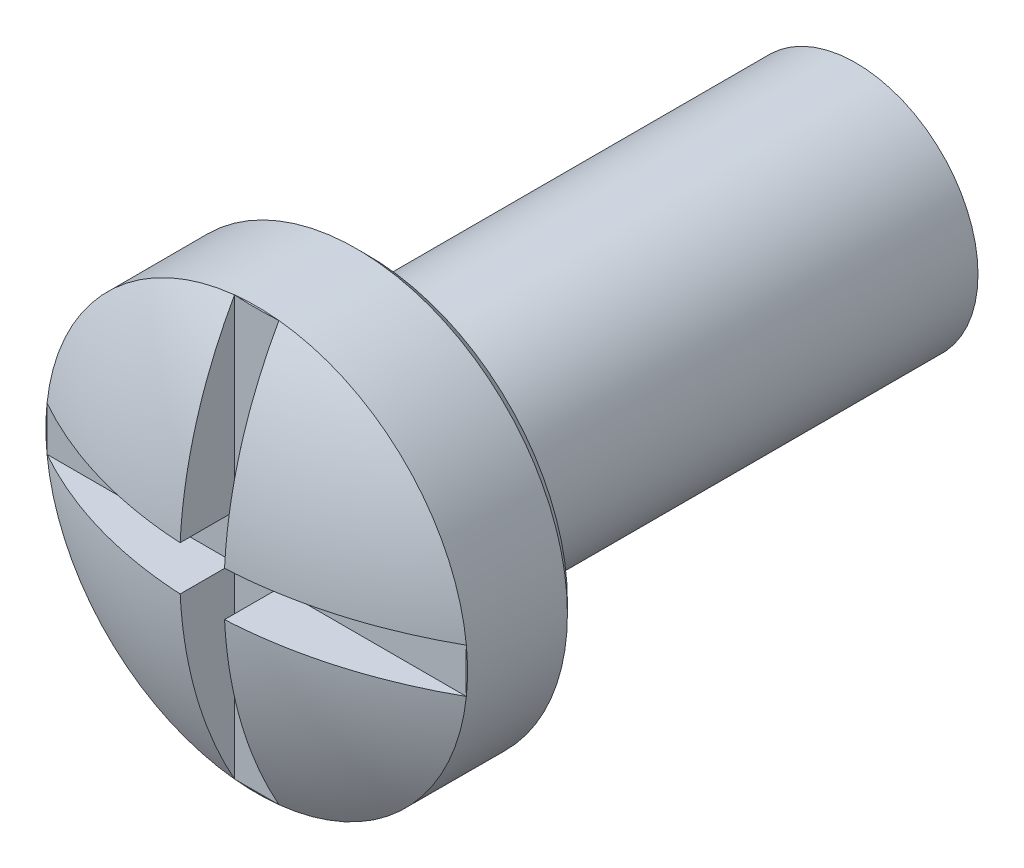
ISO-10303-21;
HEADER;
FILE_DESCRIPTION(('STEP AP214'),'2;1');
FILE_NAME('part.step','',(''),(''),'','','');
FILE_SCHEMA(('AUTOMOTIVE_DESIGN { 1 0 10303 214 1 1 1 1 }'));
ENDSEC;
DATA;
#1=APPLICATION_CONTEXT('core data for automotive mechanical design processes');
#2=APPLICATION_PROTOCOL_DEFINITION('international standard','automotive_design',2000,#1);
#3=PRODUCT_CONTEXT('',#1,'mechanical');
#4=PRODUCT('Part','Part','',(#3));
#5=PRODUCT_RELATED_PRODUCT_CATEGORY('part','',(#4));
#6=PRODUCT_DEFINITION_FORMATION('','',#4);
#7=PRODUCT_DEFINITION_CONTEXT('part definition',#1,'design');
#8=PRODUCT_DEFINITION('design','',#6,#7);
#9=PRODUCT_DEFINITION_SHAPE('','',#8);
#10=(LENGTH_UNIT() NAMED_UNIT(*) SI_UNIT(.MILLI.,.METRE.));
#11=(NAMED_UNIT(*) PLANE_ANGLE_UNIT() SI_UNIT($,.RADIAN.));
#12=(NAMED_UNIT(*) SI_UNIT($,.STERADIAN.) SOLID_ANGLE_UNIT());
#13=UNCERTAINTY_MEASURE_WITH_UNIT(LENGTH_MEASURE(1.E-05),#10,'distance_accuracy_value','');
#14=(GEOMETRIC_REPRESENTATION_CONTEXT(3) GLOBAL_UNCERTAINTY_ASSIGNED_CONTEXT((#13)) GLOBAL_UNIT_ASSIGNED_CONTEXT((#10,
#11,#12)) REPRESENTATION_CONTEXT('',''));
#15=CARTESIAN_POINT('',(0.,0.,0.));
#16=DIRECTION('',(0.,0.,1.));
#17=DIRECTION('',(1.,0.,0.));
#18=AXIS2_PLACEMENT_3D('',#15,#16,#17);
#19=CARTESIAN_POINT('',(0.,0.,-11.8));
#20=DIRECTION('',(0.,0.,-1.));
#21=DIRECTION('',(0.,1.,0.));
#22=AXIS2_PLACEMENT_3D('',#19,#20,#21);
#23=SPHERICAL_SURFACE('',#22,19.3);
#24=CARTESIAN_POINT('',(-1.,0.,-11.8));
#25=DIRECTION('',(-1.,0.,0.));
#26=DIRECTION('',(0.,0.,1.));
#27=AXIS2_PLACEMENT_3D('',#24,#25,#26);
#28=CIRCLE('',#27,19.2740758533321);
#29=CARTESIAN_POINT('',(-1.,-9.44722181384559,5.));
#30=VERTEX_POINT('',#29);
#31=CARTESIAN_POINT('',(-1.,-1.,7.44811679100061));
#32=VERTEX_POINT('',#31);
#33=EDGE_CURVE('E320',#30,#32,#28,.T.);
#34=ORIENTED_EDGE('',*,*,#33,.T.);
#35=CARTESIAN_POINT('',(0.,-1.,-11.8));
#36=DIRECTION('',(0.,1.,0.));
#37=DIRECTION('',(0.,0.,1.));
#38=AXIS2_PLACEMENT_3D('',#35,#36,#37);
#39=CIRCLE('',#38,19.2740758533321);
#40=CARTESIAN_POINT('',(-9.4472218138456,-0.999999999999952,5.));
#41=VERTEX_POINT('',#40);
#42=EDGE_CURVE('E208',#41,#32,#39,.T.);
#43=ORIENTED_EDGE('',*,*,#42,.F.);
#44=CARTESIAN_POINT('',(0.,0.,5.));
#45=DIRECTION('',(0.,0.,1.));
#46=DIRECTION('',(1.,0.,0.));
#47=AXIS2_PLACEMENT_3D('',#44,#45,#46);
#48=CIRCLE('',#47,9.5);
#49=EDGE_CURVE('E347',#41,#30,#48,.T.);
#50=ORIENTED_EDGE('',*,*,#49,.T.);
#51=EDGE_LOOP('',(#34,#43,#50));
#52=FACE_BOUND('',#51,.T.);
#53=ADVANCED_FACE('F90',(#52),#23,.T.);
#54=CARTESIAN_POINT('',(-9.44722181384559,1.,5.));
#55=VERTEX_POINT('',#54);
#56=EDGE_CURVE('E354',#55,#41,#48,.T.);
#57=ORIENTED_EDGE('',*,*,#56,.T.);
#58=CARTESIAN_POINT('',(-9.44722181384559,0.,-11.8));
#59=DIRECTION('',(1.,0.,0.));
#60=DIRECTION('',(0.,0.,-1.));
#61=AXIS2_PLACEMENT_3D('',#58,#59,#60);
#62=CIRCLE('',#61,16.8297355891291);
#63=EDGE_CURVE('E212',#55,#41,#62,.T.);
#64=ORIENTED_EDGE('',*,*,#63,.F.);
#65=EDGE_LOOP('',(#57,#64));
#66=FACE_BOUND('',#65,.T.);
#67=ADVANCED_FACE('F278',(#66),#23,.T.);
#68=CARTESIAN_POINT('',(0.,1.,-11.8));
#69=DIRECTION('',(0.,1.,0.));
#70=DIRECTION('',(0.,0.,1.));
#71=AXIS2_PLACEMENT_3D('',#68,#69,#70);
#72=CIRCLE('',#71,19.2740758533321);
#73=CARTESIAN_POINT('',(-1.,1.,7.44811679100061));
#74=VERTEX_POINT('',#73);
#75=EDGE_CURVE('E181',#55,#74,#72,.T.);
#76=ORIENTED_EDGE('',*,*,#75,.T.);
#77=CARTESIAN_POINT('',(-1.,9.44722181384559,5.));
#78=VERTEX_POINT('',#77);
#79=EDGE_CURVE('E171',#74,#78,#28,.T.);
#80=ORIENTED_EDGE('',*,*,#79,.T.);
#81=EDGE_CURVE('E327',#78,#55,#48,.T.);
#82=ORIENTED_EDGE('',*,*,#81,.T.);
#83=EDGE_LOOP('',(#76,#80,#82));
#84=FACE_BOUND('',#83,.T.);
#85=ADVANCED_FACE('F286',(#84),#23,.T.);
#86=CARTESIAN_POINT('',(9.44722181384559,1.,5.));
#87=VERTEX_POINT('',#86);
#88=CARTESIAN_POINT('',(0.999999999999972,9.4472218138456,5.));
#89=VERTEX_POINT('',#88);
#90=EDGE_CURVE('E243',#87,#89,#48,.T.);
#91=ORIENTED_EDGE('',*,*,#90,.T.);
#92=CARTESIAN_POINT('',(1.,0.,-11.8));
#93=DIRECTION('',(-1.,0.,0.));
#94=DIRECTION('',(0.,0.,1.));
#95=AXIS2_PLACEMENT_3D('',#92,#93,#94);
#96=CIRCLE('',#95,19.2740758533321);
#97=CARTESIAN_POINT('',(1.,1.,7.44811679100061));
#98=VERTEX_POINT('',#97);
#99=EDGE_CURVE('E319',#98,#89,#96,.T.);
#100=ORIENTED_EDGE('',*,*,#99,.F.);
#101=EDGE_CURVE('E203',#98,#87,#72,.T.);
#102=ORIENTED_EDGE('',*,*,#101,.T.);
#103=EDGE_LOOP('',(#91,#100,#102));
#104=FACE_BOUND('',#103,.T.);
#105=ADVANCED_FACE('F332',(#104),#23,.T.);
#106=CARTESIAN_POINT('',(1.,-9.44722181384559,5.));
#107=VERTEX_POINT('',#106);
#108=EDGE_CURVE('E342',#30,#107,#48,.T.);
#109=ORIENTED_EDGE('',*,*,#108,.T.);
#110=CARTESIAN_POINT('',(0.,-9.44722181384559,-11.8));
#111=DIRECTION('',(0.,1.,0.));
#112=DIRECTION('',(0.,0.,1.));
#113=AXIS2_PLACEMENT_3D('',#110,#111,#112);
#114=CIRCLE('',#113,16.8297355891291);
#115=EDGE_CURVE('E374',#30,#107,#114,.T.);
#116=ORIENTED_EDGE('',*,*,#115,.F.);
#117=EDGE_LOOP('',(#109,#116));
#118=FACE_BOUND('',#117,.T.);
#119=ADVANCED_FACE('F311',(#118),#23,.T.);
#120=CARTESIAN_POINT('',(1.,-1.,7.44811679100061));
#121=VERTEX_POINT('',#120);
#122=CARTESIAN_POINT('',(9.44722181384559,-1.,5.));
#123=VERTEX_POINT('',#122);
#124=EDGE_CURVE('E207',#121,#123,#39,.T.);
#125=ORIENTED_EDGE('',*,*,#124,.F.);
#126=EDGE_CURVE('E107',#107,#121,#96,.T.);
#127=ORIENTED_EDGE('',*,*,#126,.F.);
#128=EDGE_CURVE('E339',#107,#123,#48,.T.);
#129=ORIENTED_EDGE('',*,*,#128,.T.);
#130=EDGE_LOOP('',(#125,#127,#129));
#131=FACE_BOUND('',#130,.T.);
#132=ADVANCED_FACE('F304',(#131),#23,.T.);
#133=CARTESIAN_POINT('',(0.,9.44722181384559,-11.8));
#134=DIRECTION('',(0.,1.,0.));
#135=DIRECTION('',(0.,0.,1.));
#136=AXIS2_PLACEMENT_3D('',#133,#134,#135);
#137=CIRCLE('',#136,16.8297355891291);
#138=EDGE_CURVE('E315',#78,#89,#137,.T.);
#139=ORIENTED_EDGE('',*,*,#138,.T.);
#140=EDGE_CURVE('E246',#89,#78,#48,.T.);
#141=ORIENTED_EDGE('',*,*,#140,.T.);
#142=EDGE_LOOP('',(#139,#141));
#143=FACE_BOUND('',#142,.T.);
#144=ADVANCED_FACE('F294',(#143),#23,.T.);
#145=CARTESIAN_POINT('',(0.,0.,5.));
#146=DIRECTION('',(0.,0.,-1.));
#147=DIRECTION('',(-1.,0.,0.));
#148=AXIS2_PLACEMENT_3D('',#145,#146,#147);
#149=CYLINDRICAL_SURFACE('',#148,9.5);
#150=CARTESIAN_POINT('',(0.,0.,0.500000000000011));
#151=DIRECTION('',(0.,0.,1.));
#152=DIRECTION('',(1.,0.,0.));
#153=AXIS2_PLACEMENT_3D('',#150,#151,#152);
#154=CIRCLE('',#153,9.5);
#155=CARTESIAN_POINT('',(9.5,0.,0.500000000000011));
#156=VERTEX_POINT('',#155);
#157=EDGE_CURVE('E100',#156,#156,#154,.T.);
#158=ORIENTED_EDGE('',*,*,#157,.T.);
#159=EDGE_LOOP('',(#158));
#160=FACE_BOUND('',#159,.T.);
#161=ORIENTED_EDGE('',*,*,#90,.F.);
#162=EDGE_CURVE('E239',#123,#87,#48,.T.);
#163=ORIENTED_EDGE('',*,*,#162,.F.);
#164=ORIENTED_EDGE('',*,*,#128,.F.);
#165=ORIENTED_EDGE('',*,*,#108,.F.);
#166=ORIENTED_EDGE('',*,*,#49,.F.);
#167=ORIENTED_EDGE('',*,*,#56,.F.);
#168=ORIENTED_EDGE('',*,*,#81,.F.);
#169=ORIENTED_EDGE('',*,*,#140,.F.);
#170=EDGE_LOOP('',(#161,#163,#164,#165,#166,#167,#168,#169));
#171=FACE_BOUND('',#170,.T.);
#172=ADVANCED_FACE('F252',(#160,#171),#149,.T.);
#173=CARTESIAN_POINT('',(0.,0.,0.));
#174=DIRECTION('',(0.,0.,1.));
#175=DIRECTION('',(1.,0.,0.));
#176=AXIS2_PLACEMENT_3D('',#173,#174,#175);
#177=PLANE('',#176);
#178=CARTESIAN_POINT('',(0.,0.,0.));
#179=DIRECTION('',(0.,0.,1.));
#180=DIRECTION('',(1.,0.,0.));
#181=AXIS2_PLACEMENT_3D('',#178,#179,#180);
#182=CIRCLE('',#181,8.99999999999999);
#183=CARTESIAN_POINT('',(8.99999999999999,0.,0.));
#184=VERTEX_POINT('',#183);
#185=EDGE_CURVE('E12',#184,#184,#182,.F.);
#186=ORIENTED_EDGE('',*,*,#185,.T.);
#187=EDGE_LOOP('',(#186));
#188=FACE_BOUND('',#187,.T.);
#189=CARTESIAN_POINT('',(0.,0.,0.));
#190=DIRECTION('',(0.,0.,1.));
#191=DIRECTION('',(1.,0.,0.));
#192=AXIS2_PLACEMENT_3D('',#189,#190,#191);
#193=CIRCLE('',#192,5.5);
#194=CARTESIAN_POINT('',(5.5,0.,0.));
#195=VERTEX_POINT('',#194);
#196=EDGE_CURVE('E234',#195,#195,#193,.T.);
#197=ORIENTED_EDGE('',*,*,#196,.T.);
#198=EDGE_LOOP('',(#197));
#199=FACE_BOUND('',#198,.T.);
#200=ADVANCED_FACE('F310',(#188,#199),#177,.F.);
#201=CARTESIAN_POINT('',(0.,0.,-22.));
#202=DIRECTION('',(0.,0.,1.));
#203=DIRECTION('',(1.,0.,0.));
#204=AXIS2_PLACEMENT_3D('',#201,#202,#203);
#205=CYLINDRICAL_SURFACE('',#204,5.5);
#206=CARTESIAN_POINT('',(0.,0.,-22.));
#207=DIRECTION('',(0.,0.,1.));
#208=DIRECTION('',(1.,0.,0.));
#209=AXIS2_PLACEMENT_3D('',#206,#207,#208);
#210=CIRCLE('',#209,5.5);
#211=CARTESIAN_POINT('',(5.5,0.,-22.));
#212=VERTEX_POINT('',#211);
#213=EDGE_CURVE('E235',#212,#212,#210,.T.);
#214=ORIENTED_EDGE('',*,*,#213,.T.);
#215=EDGE_LOOP('',(#214));
#216=FACE_BOUND('',#215,.T.);
#217=ORIENTED_EDGE('',*,*,#196,.F.);
#218=EDGE_LOOP('',(#217));
#219=FACE_BOUND('',#218,.T.);
#220=ADVANCED_FACE('F302',(#216,#219),#205,.T.);
#221=CARTESIAN_POINT('',(0.,0.,-22.));
#222=DIRECTION('',(0.,0.,1.));
#223=DIRECTION('',(1.,0.,0.));
#224=AXIS2_PLACEMENT_3D('',#221,#222,#223);
#225=PLANE('',#224);
#226=CARTESIAN_POINT('',(0.,0.,-22.));
#227=DIRECTION('',(0.,0.,-1.));
#228=DIRECTION('',(-1.,0.,0.));
#229=AXIS2_PLACEMENT_3D('',#226,#227,#228);
#230=CIRCLE('',#229,3.);
#231=CARTESIAN_POINT('',(-3.,0.,-22.));
#232=VERTEX_POINT('',#231);
#233=EDGE_CURVE('E369',#232,#232,#230,.T.);
#234=ORIENTED_EDGE('',*,*,#233,.F.);
#235=EDGE_LOOP('',(#234));
#236=FACE_BOUND('',#235,.T.);
#237=ORIENTED_EDGE('',*,*,#213,.F.);
#238=EDGE_LOOP('',(#237));
#239=FACE_BOUND('',#238,.T.);
#240=ADVANCED_FACE('F292',(#236,#239),#225,.F.);
#241=CARTESIAN_POINT('',(9.44722181384559,0.,-11.8));
#242=DIRECTION('',(1.,0.,0.));
#243=DIRECTION('',(0.,0.,-1.));
#244=AXIS2_PLACEMENT_3D('',#241,#242,#243);
#245=CIRCLE('',#244,16.8297355891291);
#246=EDGE_CURVE('E202',#87,#123,#245,.T.);
#247=ORIENTED_EDGE('',*,*,#246,.T.);
#248=ORIENTED_EDGE('',*,*,#162,.T.);
#249=EDGE_LOOP('',(#247,#248));
#250=FACE_BOUND('',#249,.T.);
#251=ADVANCED_FACE('F281',(#250),#23,.T.);
#252=CARTESIAN_POINT('',(-1.,-9.44722181384559,7.501));
#253=DIRECTION('',(-1.,0.,0.));
#254=DIRECTION('',(0.,0.,1.));
#255=AXIS2_PLACEMENT_3D('',#252,#253,#254);
#256=PLANE('',#255);
#257=DIRECTION('',(0.,0.,-1.));
#258=VECTOR('',#257,1.);
#259=CARTESIAN_POINT('',(-1.,1.,7.501));
#260=LINE('',#259,#258);
#261=CARTESIAN_POINT('',(-1.,1.,5.));
#262=VERTEX_POINT('',#261);
#263=EDGE_CURVE('E164',#74,#262,#260,.T.);
#264=ORIENTED_EDGE('',*,*,#263,.T.);
#265=DIRECTION('',(0.,1.,0.));
#266=VECTOR('',#265,1.);
#267=CARTESIAN_POINT('',(-1.,-9.44722181384559,5.));
#268=LINE('',#267,#266);
#269=EDGE_CURVE('E168',#262,#78,#268,.T.);
#270=ORIENTED_EDGE('',*,*,#269,.T.);
#271=ORIENTED_EDGE('',*,*,#79,.F.);
#272=EDGE_LOOP('',(#264,#270,#271));
#273=FACE_BOUND('',#272,.T.);
#274=ADVANCED_FACE('F166',(#273),#256,.F.);
#275=CARTESIAN_POINT('',(-1.,9.44722181384559,7.501));
#276=DIRECTION('',(0.,1.,0.));
#277=DIRECTION('',(0.,0.,1.));
#278=AXIS2_PLACEMENT_3D('',#275,#276,#277);
#279=PLANE('',#278);
#280=DIRECTION('',(1.,0.,0.));
#281=VECTOR('',#280,1.);
#282=CARTESIAN_POINT('',(-1.,9.44722181384559,5.));
#283=LINE('',#282,#281);
#284=EDGE_CURVE('E189',#78,#89,#283,.T.);
#285=ORIENTED_EDGE('',*,*,#284,.T.);
#286=ORIENTED_EDGE('',*,*,#138,.F.);
#287=EDGE_LOOP('',(#285,#286));
#288=FACE_BOUND('',#287,.T.);
#289=ADVANCED_FACE('F299',(#288),#279,.F.);
#290=CARTESIAN_POINT('',(1.,-9.44722181384559,7.501));
#291=DIRECTION('',(-1.,0.,0.));
#292=DIRECTION('',(0.,0.,1.));
#293=AXIS2_PLACEMENT_3D('',#290,#291,#292);
#294=PLANE('',#293);
#295=ORIENTED_EDGE('',*,*,#99,.T.);
#296=DIRECTION('',(0.,1.,0.));
#297=VECTOR('',#296,1.);
#298=CARTESIAN_POINT('',(1.,-9.44722181384559,5.));
#299=LINE('',#298,#297);
#300=CARTESIAN_POINT('',(1.,1.,5.));
#301=VERTEX_POINT('',#300);
#302=EDGE_CURVE('E140',#301,#89,#299,.T.);
#303=ORIENTED_EDGE('',*,*,#302,.F.);
#304=DIRECTION('',(0.,0.,-1.));
#305=VECTOR('',#304,1.);
#306=CARTESIAN_POINT('',(1.,1.,7.501));
#307=LINE('',#306,#305);
#308=EDGE_CURVE('E116',#98,#301,#307,.T.);
#309=ORIENTED_EDGE('',*,*,#308,.F.);
#310=EDGE_LOOP('',(#295,#303,#309));
#311=FACE_BOUND('',#310,.T.);
#312=ADVANCED_FACE('F393',(#311),#294,.T.);
#313=CARTESIAN_POINT('',(0.,0.,5.));
#314=DIRECTION('',(0.,0.,1.));
#315=DIRECTION('',(1.,0.,0.));
#316=AXIS2_PLACEMENT_3D('',#313,#314,#315);
#317=PLANE('',#316);
#318=ORIENTED_EDGE('',*,*,#302,.T.);
#319=ORIENTED_EDGE('',*,*,#284,.F.);
#320=ORIENTED_EDGE('',*,*,#269,.F.);
#321=DIRECTION('',(1.,0.,0.));
#322=VECTOR('',#321,1.);
#323=CARTESIAN_POINT('',(-9.44722181384559,1.,5.));
#324=LINE('',#323,#322);
#325=EDGE_CURVE('E179',#55,#262,#324,.T.);
#326=ORIENTED_EDGE('',*,*,#325,.F.);
#327=DIRECTION('',(0.,-1.,0.));
#328=VECTOR('',#327,1.);
#329=CARTESIAN_POINT('',(-9.44722181384559,1.,5.));
#330=LINE('',#329,#328);
#331=EDGE_CURVE('E215',#55,#41,#330,.T.);
#332=ORIENTED_EDGE('',*,*,#331,.T.);
#333=DIRECTION('',(1.,0.,0.));
#334=VECTOR('',#333,1.);
#335=CARTESIAN_POINT('',(-9.44722181384559,-1.,5.));
#336=LINE('',#335,#334);
#337=CARTESIAN_POINT('',(-1.,-1.,5.));
#338=VERTEX_POINT('',#337);
#339=EDGE_CURVE('E219',#41,#338,#336,.T.);
#340=ORIENTED_EDGE('',*,*,#339,.T.);
#341=EDGE_CURVE('E176',#30,#338,#268,.T.);
#342=ORIENTED_EDGE('',*,*,#341,.F.);
#343=DIRECTION('',(1.,0.,0.));
#344=VECTOR('',#343,1.);
#345=CARTESIAN_POINT('',(-1.,-9.44722181384559,5.));
#346=LINE('',#345,#344);
#347=EDGE_CURVE('E377',#30,#107,#346,.T.);
#348=ORIENTED_EDGE('',*,*,#347,.T.);
#349=CARTESIAN_POINT('',(1.,-1.,5.));
#350=VERTEX_POINT('',#349);
#351=EDGE_CURVE('E196',#107,#350,#299,.T.);
#352=ORIENTED_EDGE('',*,*,#351,.T.);
#353=EDGE_CURVE('E218',#350,#123,#336,.T.);
#354=ORIENTED_EDGE('',*,*,#353,.T.);
#355=DIRECTION('',(0.,-1.,0.));
#356=VECTOR('',#355,1.);
#357=CARTESIAN_POINT('',(9.44722181384559,1.,5.));
#358=LINE('',#357,#356);
#359=EDGE_CURVE('E223',#87,#123,#358,.T.);
#360=ORIENTED_EDGE('',*,*,#359,.F.);
#361=EDGE_CURVE('E132',#301,#87,#324,.T.);
#362=ORIENTED_EDGE('',*,*,#361,.F.);
#363=EDGE_LOOP('',(#318,#319,#320,#326,#332,#340,#342,#348,#352,#354,#360,#362));
#364=FACE_BOUND('',#363,.T.);
#365=ADVANCED_FACE('F187',(#364),#317,.T.);
#366=CARTESIAN_POINT('',(-1.,-9.44722181384559,7.501));
#367=DIRECTION('',(0.,1.,0.));
#368=DIRECTION('',(0.,0.,1.));
#369=AXIS2_PLACEMENT_3D('',#366,#367,#368);
#370=PLANE('',#369);
#371=ORIENTED_EDGE('',*,*,#115,.T.);
#372=ORIENTED_EDGE('',*,*,#347,.F.);
#373=EDGE_LOOP('',(#371,#372));
#374=FACE_BOUND('',#373,.T.);
#375=ADVANCED_FACE('F403',(#374),#370,.T.);
#376=ORIENTED_EDGE('',*,*,#33,.F.);
#377=ORIENTED_EDGE('',*,*,#341,.T.);
#378=DIRECTION('',(0.,0.,-1.));
#379=VECTOR('',#378,1.);
#380=CARTESIAN_POINT('',(-1.,-1.,7.501));
#381=LINE('',#380,#379);
#382=EDGE_CURVE('E175',#32,#338,#381,.T.);
#383=ORIENTED_EDGE('',*,*,#382,.F.);
#384=EDGE_LOOP('',(#376,#377,#383));
#385=FACE_BOUND('',#384,.T.);
#386=ADVANCED_FACE('F301',(#385),#256,.F.);
#387=DIRECTION('',(0.,0.,-1.));
#388=VECTOR('',#387,1.);
#389=CARTESIAN_POINT('',(1.,-1.,7.501));
#390=LINE('',#389,#388);
#391=EDGE_CURVE('E229',#121,#350,#390,.T.);
#392=ORIENTED_EDGE('',*,*,#391,.T.);
#393=ORIENTED_EDGE('',*,*,#351,.F.);
#394=ORIENTED_EDGE('',*,*,#126,.T.);
#395=EDGE_LOOP('',(#392,#393,#394));
#396=FACE_BOUND('',#395,.T.);
#397=ADVANCED_FACE('F400',(#396),#294,.T.);
#398=CARTESIAN_POINT('',(-9.44722181384559,1.,7.501));
#399=DIRECTION('',(1.,0.,0.));
#400=DIRECTION('',(0.,0.,-1.));
#401=AXIS2_PLACEMENT_3D('',#398,#399,#400);
#402=PLANE('',#401);
#403=ORIENTED_EDGE('',*,*,#63,.T.);
#404=ORIENTED_EDGE('',*,*,#331,.F.);
#405=EDGE_LOOP('',(#403,#404));
#406=FACE_BOUND('',#405,.T.);
#407=ADVANCED_FACE('F408',(#406),#402,.T.);
#408=CARTESIAN_POINT('',(-9.44722181384559,1.,7.501));
#409=DIRECTION('',(0.,1.,0.));
#410=DIRECTION('',(0.,0.,1.));
#411=AXIS2_PLACEMENT_3D('',#408,#409,#410);
#412=PLANE('',#411);
#413=ORIENTED_EDGE('',*,*,#75,.F.);
#414=ORIENTED_EDGE('',*,*,#325,.T.);
#415=ORIENTED_EDGE('',*,*,#263,.F.);
#416=EDGE_LOOP('',(#413,#414,#415));
#417=FACE_BOUND('',#416,.T.);
#418=ADVANCED_FACE('F180',(#417),#412,.F.);
#419=CARTESIAN_POINT('',(-9.44722181384559,-1.,7.501));
#420=DIRECTION('',(0.,1.,0.));
#421=DIRECTION('',(0.,0.,1.));
#422=AXIS2_PLACEMENT_3D('',#419,#420,#421);
#423=PLANE('',#422);
#424=ORIENTED_EDGE('',*,*,#382,.T.);
#425=ORIENTED_EDGE('',*,*,#339,.F.);
#426=ORIENTED_EDGE('',*,*,#42,.T.);
#427=EDGE_LOOP('',(#424,#425,#426));
#428=FACE_BOUND('',#427,.T.);
#429=ADVANCED_FACE('F271',(#428),#423,.T.);
#430=ORIENTED_EDGE('',*,*,#308,.T.);
#431=ORIENTED_EDGE('',*,*,#361,.T.);
#432=ORIENTED_EDGE('',*,*,#101,.F.);
#433=EDGE_LOOP('',(#430,#431,#432));
#434=FACE_BOUND('',#433,.T.);
#435=ADVANCED_FACE('F272',(#434),#412,.F.);
#436=CARTESIAN_POINT('',(9.44722181384559,1.,7.501));
#437=DIRECTION('',(1.,0.,0.));
#438=DIRECTION('',(0.,0.,-1.));
#439=AXIS2_PLACEMENT_3D('',#436,#437,#438);
#440=PLANE('',#439);
#441=ORIENTED_EDGE('',*,*,#359,.T.);
#442=ORIENTED_EDGE('',*,*,#246,.F.);
#443=EDGE_LOOP('',(#441,#442));
#444=FACE_BOUND('',#443,.T.);
#445=ADVANCED_FACE('F259',(#444),#440,.F.);
#446=ORIENTED_EDGE('',*,*,#124,.T.);
#447=ORIENTED_EDGE('',*,*,#353,.F.);
#448=ORIENTED_EDGE('',*,*,#391,.F.);
#449=EDGE_LOOP('',(#446,#447,#448));
#450=FACE_BOUND('',#449,.T.);
#451=ADVANCED_FACE('F257',(#450),#423,.T.);
#452=CARTESIAN_POINT('',(0.,0.,0.500000000000011));
#453=DIRECTION('',(0.,0.,1.));
#454=DIRECTION('',(1.,0.,0.));
#455=AXIS2_PLACEMENT_3D('',#452,#453,#454);
#456=CONICAL_SURFACE('',#455,9.5,0.785398163397447);
#457=ORIENTED_EDGE('',*,*,#185,.F.);
#458=EDGE_LOOP('',(#457));
#459=FACE_BOUND('',#458,.T.);
#460=ORIENTED_EDGE('',*,*,#157,.F.);
#461=EDGE_LOOP('',(#460));
#462=FACE_BOUND('',#461,.T.);
#463=ADVANCED_FACE('F93',(#459,#462),#456,.T.);
#464=CARTESIAN_POINT('',(0.,0.,-2.));
#465=DIRECTION('',(0.,0.,-1.));
#466=DIRECTION('',(-1.,0.,0.));
#467=AXIS2_PLACEMENT_3D('',#464,#465,#466);
#468=CYLINDRICAL_SURFACE('',#467,3.);
#469=CARTESIAN_POINT('',(0.,0.,-2.));
#470=DIRECTION('',(0.,0.,-1.));
#471=DIRECTION('',(-1.,0.,0.));
#472=AXIS2_PLACEMENT_3D('',#469,#470,#471);
#473=CIRCLE('',#472,3.);
#474=CARTESIAN_POINT('',(-3.,0.,-2.));
#475=VERTEX_POINT('',#474);
#476=EDGE_CURVE('E335',#475,#475,#473,.T.);
#477=ORIENTED_EDGE('',*,*,#476,.F.);
#478=EDGE_LOOP('',(#477));
#479=FACE_BOUND('',#478,.T.);
#480=ORIENTED_EDGE('',*,*,#233,.T.);
#481=EDGE_LOOP('',(#480));
#482=FACE_BOUND('',#481,.T.);
#483=ADVANCED_FACE('F256',(#479,#482),#468,.F.);
#484=CARTESIAN_POINT('',(0.,0.,-2.));
#485=DIRECTION('',(0.,0.,-1.));
#486=DIRECTION('',(-1.,0.,0.));
#487=AXIS2_PLACEMENT_3D('',#484,#485,#486);
#488=PLANE('',#487);
#489=ORIENTED_EDGE('',*,*,#476,.T.);
#490=EDGE_LOOP('',(#489));
#491=FACE_BOUND('',#490,.T.);
#492=ADVANCED_FACE('F265',(#491),#488,.T.);
#493=CLOSED_SHELL('',(#53,#67,#85,#105,#119,#132,#144,#172,#200,#220,#240,#251,#274,#289,#312,
#365,#375,#386,#397,#407,#418,#429,#435,#445,#451,#463,#483,#492));
#494=MANIFOLD_SOLID_BREP('B2',#493);
#495=ADVANCED_BREP_SHAPE_REPRESENTATION('',(#18,#494),#14);
#496=SHAPE_DEFINITION_REPRESENTATION(#9,#495);
ENDSEC;
END-ISO-10303-21;
